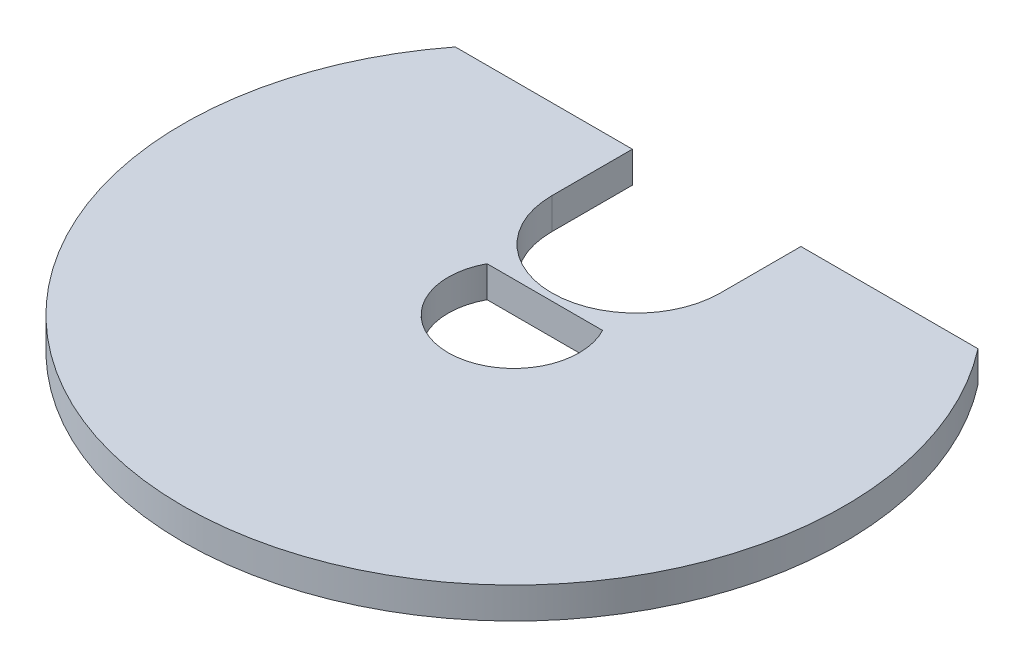
ISO-10303-21;
HEADER;
FILE_DESCRIPTION(('STEP AP214'),'2;1');
FILE_NAME('part.step','',(''),(''),'','','');
FILE_SCHEMA(('AUTOMOTIVE_DESIGN { 1 0 10303 214 1 1 1 1 }'));
ENDSEC;
DATA;
#1=APPLICATION_CONTEXT('core data for automotive mechanical design processes');
#2=APPLICATION_PROTOCOL_DEFINITION('international standard','automotive_design',2000,#1);
#3=PRODUCT_CONTEXT('',#1,'mechanical');
#4=PRODUCT('Part','Part','',(#3));
#5=PRODUCT_RELATED_PRODUCT_CATEGORY('part','',(#4));
#6=PRODUCT_DEFINITION_FORMATION('','',#4);
#7=PRODUCT_DEFINITION_CONTEXT('part definition',#1,'design');
#8=PRODUCT_DEFINITION('design','',#6,#7);
#9=PRODUCT_DEFINITION_SHAPE('','',#8);
#10=(LENGTH_UNIT() NAMED_UNIT(*) SI_UNIT(.MILLI.,.METRE.));
#11=(NAMED_UNIT(*) PLANE_ANGLE_UNIT() SI_UNIT($,.RADIAN.));
#12=(NAMED_UNIT(*) SI_UNIT($,.STERADIAN.) SOLID_ANGLE_UNIT());
#13=UNCERTAINTY_MEASURE_WITH_UNIT(LENGTH_MEASURE(1.E-05),#10,'distance_accuracy_value','');
#14=(GEOMETRIC_REPRESENTATION_CONTEXT(3) GLOBAL_UNCERTAINTY_ASSIGNED_CONTEXT((#13)) GLOBAL_UNIT_ASSIGNED_CONTEXT((#10,
#11,#12)) REPRESENTATION_CONTEXT('',''));
#15=CARTESIAN_POINT('',(0.,0.,0.));
#16=DIRECTION('',(0.,0.,1.));
#17=DIRECTION('',(1.,0.,0.));
#18=AXIS2_PLACEMENT_3D('',#15,#16,#17);
#19=CARTESIAN_POINT('',(-17.145,6.35,-41.275));
#20=DIRECTION('',(-1.,0.,0.));
#21=DIRECTION('',(0.,0.,1.));
#22=AXIS2_PLACEMENT_3D('',#19,#20,#21);
#23=PLANE('',#22);
#24=DIRECTION('',(0.,0.,-1.));
#25=VECTOR('',#24,1.);
#26=CARTESIAN_POINT('',(-17.145,0.,-41.275));
#27=LINE('',#26,#25);
#28=CARTESIAN_POINT('',(-17.145,0.,-24.892));
#29=VERTEX_POINT('',#28);
#30=CARTESIAN_POINT('',(-17.145,0.,-41.275));
#31=VERTEX_POINT('',#30);
#32=EDGE_CURVE('E129',#29,#31,#27,.T.);
#33=ORIENTED_EDGE('',*,*,#32,.T.);
#34=DIRECTION('',(0.,-1.,0.));
#35=VECTOR('',#34,1.);
#36=CARTESIAN_POINT('',(-17.145,6.35,-41.275));
#37=LINE('',#36,#35);
#38=CARTESIAN_POINT('',(-17.145,6.35,-41.275));
#39=VERTEX_POINT('',#38);
#40=EDGE_CURVE('E11',#39,#31,#37,.T.);
#41=ORIENTED_EDGE('',*,*,#40,.F.);
#42=DIRECTION('',(0.,0.,-1.));
#43=VECTOR('',#42,1.);
#44=CARTESIAN_POINT('',(-17.145,6.35,-41.275));
#45=LINE('',#44,#43);
#46=CARTESIAN_POINT('',(-17.145,6.35,-24.892));
#47=VERTEX_POINT('',#46);
#48=EDGE_CURVE('E131',#47,#39,#45,.T.);
#49=ORIENTED_EDGE('',*,*,#48,.F.);
#50=DIRECTION('',(0.,-1.,0.));
#51=VECTOR('',#50,1.);
#52=CARTESIAN_POINT('',(-17.145,6.35,-24.892));
#53=LINE('',#52,#51);
#54=EDGE_CURVE('E151',#47,#29,#53,.T.);
#55=ORIENTED_EDGE('',*,*,#54,.T.);
#56=EDGE_LOOP('',(#33,#41,#49,#55));
#57=FACE_BOUND('',#56,.T.);
#58=ADVANCED_FACE('F42',(#57),#23,.F.);
#59=CARTESIAN_POINT('',(-53.1696386577904,6.35,-41.275));
#60=DIRECTION('',(0.,0.,1.));
#61=DIRECTION('',(1.,0.,0.));
#62=AXIS2_PLACEMENT_3D('',#59,#60,#61);
#63=PLANE('',#62);
#64=DIRECTION('',(-1.,0.,0.));
#65=VECTOR('',#64,1.);
#66=CARTESIAN_POINT('',(-53.1696386577904,0.,-41.275));
#67=LINE('',#66,#65);
#68=CARTESIAN_POINT('',(-53.1696386577904,0.,-41.275));
#69=VERTEX_POINT('',#68);
#70=EDGE_CURVE('E155',#31,#69,#67,.T.);
#71=ORIENTED_EDGE('',*,*,#70,.T.);
#72=DIRECTION('',(0.,-1.,0.));
#73=VECTOR('',#72,1.);
#74=CARTESIAN_POINT('',(-53.1696386577904,6.35,-41.275));
#75=LINE('',#74,#73);
#76=CARTESIAN_POINT('',(-53.1696386577904,6.35,-41.275));
#77=VERTEX_POINT('',#76);
#78=EDGE_CURVE('E50',#77,#69,#75,.T.);
#79=ORIENTED_EDGE('',*,*,#78,.F.);
#80=DIRECTION('',(-1.,0.,0.));
#81=VECTOR('',#80,1.);
#82=CARTESIAN_POINT('',(-53.1696386577904,6.35,-41.275));
#83=LINE('',#82,#81);
#84=EDGE_CURVE('E135',#39,#77,#83,.T.);
#85=ORIENTED_EDGE('',*,*,#84,.F.);
#86=ORIENTED_EDGE('',*,*,#40,.T.);
#87=EDGE_LOOP('',(#71,#79,#85,#86));
#88=FACE_BOUND('',#87,.T.);
#89=ADVANCED_FACE('F210',(#88),#63,.F.);
#90=CARTESIAN_POINT('',(0.,6.35,0.));
#91=DIRECTION('',(0.,-1.,0.));
#92=DIRECTION('',(0.,0.,-1.));
#93=AXIS2_PLACEMENT_3D('',#90,#91,#92);
#94=CYLINDRICAL_SURFACE('',#93,67.31);
#95=CARTESIAN_POINT('',(0.,0.,0.));
#96=DIRECTION('',(0.,1.,0.));
#97=DIRECTION('',(0.,0.,1.));
#98=AXIS2_PLACEMENT_3D('',#95,#96,#97);
#99=CIRCLE('',#98,67.31);
#100=CARTESIAN_POINT('',(53.1696386577904,0.,-41.275));
#101=VERTEX_POINT('',#100);
#102=EDGE_CURVE('E158',#69,#101,#99,.T.);
#103=ORIENTED_EDGE('',*,*,#102,.T.);
#104=DIRECTION('',(0.,-1.,0.));
#105=VECTOR('',#104,1.);
#106=CARTESIAN_POINT('',(53.1696386577904,6.35,-41.275));
#107=LINE('',#106,#105);
#108=CARTESIAN_POINT('',(53.1696386577904,6.35,-41.275));
#109=VERTEX_POINT('',#108);
#110=EDGE_CURVE('E180',#109,#101,#107,.T.);
#111=ORIENTED_EDGE('',*,*,#110,.F.);
#112=CARTESIAN_POINT('',(0.,6.35,0.));
#113=DIRECTION('',(0.,1.,0.));
#114=DIRECTION('',(0.,0.,1.));
#115=AXIS2_PLACEMENT_3D('',#112,#113,#114);
#116=CIRCLE('',#115,67.31);
#117=EDGE_CURVE('E139',#77,#109,#116,.T.);
#118=ORIENTED_EDGE('',*,*,#117,.F.);
#119=ORIENTED_EDGE('',*,*,#78,.T.);
#120=EDGE_LOOP('',(#103,#111,#118,#119));
#121=FACE_BOUND('',#120,.T.);
#122=ADVANCED_FACE('F189',(#121),#94,.T.);
#123=CARTESIAN_POINT('',(17.145,6.35,-41.275));
#124=DIRECTION('',(0.,0.,1.));
#125=DIRECTION('',(1.,0.,0.));
#126=AXIS2_PLACEMENT_3D('',#123,#124,#125);
#127=PLANE('',#126);
#128=DIRECTION('',(-1.,0.,0.));
#129=VECTOR('',#128,1.);
#130=CARTESIAN_POINT('',(17.145,0.,-41.275));
#131=LINE('',#130,#129);
#132=CARTESIAN_POINT('',(17.145,0.,-41.275));
#133=VERTEX_POINT('',#132);
#134=EDGE_CURVE('E161',#101,#133,#131,.T.);
#135=ORIENTED_EDGE('',*,*,#134,.T.);
#136=DIRECTION('',(0.,-1.,0.));
#137=VECTOR('',#136,1.);
#138=CARTESIAN_POINT('',(17.145,6.35,-41.275));
#139=LINE('',#138,#137);
#140=CARTESIAN_POINT('',(17.145,6.35,-41.275));
#141=VERTEX_POINT('',#140);
#142=EDGE_CURVE('E176',#141,#133,#139,.T.);
#143=ORIENTED_EDGE('',*,*,#142,.F.);
#144=DIRECTION('',(-1.,0.,0.));
#145=VECTOR('',#144,1.);
#146=CARTESIAN_POINT('',(17.145,6.35,-41.275));
#147=LINE('',#146,#145);
#148=EDGE_CURVE('E142',#109,#141,#147,.T.);
#149=ORIENTED_EDGE('',*,*,#148,.F.);
#150=ORIENTED_EDGE('',*,*,#110,.T.);
#151=EDGE_LOOP('',(#135,#143,#149,#150));
#152=FACE_BOUND('',#151,.T.);
#153=ADVANCED_FACE('F198',(#152),#127,.F.);
#154=CARTESIAN_POINT('',(17.145,6.35,-24.892));
#155=DIRECTION('',(1.,0.,0.));
#156=DIRECTION('',(0.,0.,-1.));
#157=AXIS2_PLACEMENT_3D('',#154,#155,#156);
#158=PLANE('',#157);
#159=DIRECTION('',(0.,0.,1.));
#160=VECTOR('',#159,1.);
#161=CARTESIAN_POINT('',(17.145,0.,-24.892));
#162=LINE('',#161,#160);
#163=CARTESIAN_POINT('',(17.145,0.,-24.892));
#164=VERTEX_POINT('',#163);
#165=EDGE_CURVE('E164',#133,#164,#162,.T.);
#166=ORIENTED_EDGE('',*,*,#165,.T.);
#167=DIRECTION('',(0.,-1.,0.));
#168=VECTOR('',#167,1.);
#169=CARTESIAN_POINT('',(17.145,6.35,-24.892));
#170=LINE('',#169,#168);
#171=CARTESIAN_POINT('',(17.145,6.35,-24.892));
#172=VERTEX_POINT('',#171);
#173=EDGE_CURVE('E172',#172,#164,#170,.T.);
#174=ORIENTED_EDGE('',*,*,#173,.F.);
#175=DIRECTION('',(0.,0.,1.));
#176=VECTOR('',#175,1.);
#177=CARTESIAN_POINT('',(17.145,6.35,-24.892));
#178=LINE('',#177,#176);
#179=EDGE_CURVE('E145',#141,#172,#178,.T.);
#180=ORIENTED_EDGE('',*,*,#179,.F.);
#181=ORIENTED_EDGE('',*,*,#142,.T.);
#182=EDGE_LOOP('',(#166,#174,#180,#181));
#183=FACE_BOUND('',#182,.T.);
#184=ADVANCED_FACE('F202',(#183),#158,.F.);
#185=CARTESIAN_POINT('',(0.,6.35,-24.892));
#186=DIRECTION('',(0.,-1.,0.));
#187=DIRECTION('',(0.,0.,-1.));
#188=AXIS2_PLACEMENT_3D('',#185,#186,#187);
#189=CYLINDRICAL_SURFACE('',#188,17.145);
#190=CARTESIAN_POINT('',(0.,0.,-24.892));
#191=DIRECTION('',(0.,-1.,0.));
#192=DIRECTION('',(0.,0.,1.));
#193=AXIS2_PLACEMENT_3D('',#190,#191,#192);
#194=CIRCLE('',#193,17.145);
#195=EDGE_CURVE('E136',#164,#29,#194,.T.);
#196=ORIENTED_EDGE('',*,*,#195,.T.);
#197=ORIENTED_EDGE('',*,*,#54,.F.);
#198=CARTESIAN_POINT('',(0.,6.35,-24.892));
#199=DIRECTION('',(0.,-1.,0.));
#200=DIRECTION('',(0.,0.,1.));
#201=AXIS2_PLACEMENT_3D('',#198,#199,#200);
#202=CIRCLE('',#201,17.145);
#203=EDGE_CURVE('E148',#172,#47,#202,.T.);
#204=ORIENTED_EDGE('',*,*,#203,.F.);
#205=ORIENTED_EDGE('',*,*,#173,.T.);
#206=EDGE_LOOP('',(#196,#197,#204,#205));
#207=FACE_BOUND('',#206,.T.);
#208=ADVANCED_FACE('F213',(#207),#189,.F.);
#209=CARTESIAN_POINT('',(0.,6.35,-24.892));
#210=DIRECTION('',(0.,1.,0.));
#211=DIRECTION('',(0.,0.,1.));
#212=AXIS2_PLACEMENT_3D('',#209,#210,#211);
#213=PLANE('',#212);
#214=CARTESIAN_POINT('',(0.,6.35,0.));
#215=DIRECTION('',(0.,1.,0.));
#216=DIRECTION('',(0.,0.,1.));
#217=AXIS2_PLACEMENT_3D('',#214,#215,#216);
#218=CIRCLE('',#217,13.335);
#219=CARTESIAN_POINT('',(-11.7475,6.35,-6.31018769530669));
#220=VERTEX_POINT('',#219);
#221=CARTESIAN_POINT('',(11.7475,6.35,-6.31018769530669));
#222=VERTEX_POINT('',#221);
#223=EDGE_CURVE('E57',#220,#222,#218,.T.);
#224=ORIENTED_EDGE('',*,*,#223,.F.);
#225=DIRECTION('',(-1.,0.,0.));
#226=VECTOR('',#225,1.);
#227=CARTESIAN_POINT('',(-11.7475,6.35,-6.31018769530669));
#228=LINE('',#227,#226);
#229=EDGE_CURVE('E121',#222,#220,#228,.T.);
#230=ORIENTED_EDGE('',*,*,#229,.F.);
#231=EDGE_LOOP('',(#224,#230));
#232=FACE_BOUND('',#231,.T.);
#233=ORIENTED_EDGE('',*,*,#48,.T.);
#234=ORIENTED_EDGE('',*,*,#84,.T.);
#235=ORIENTED_EDGE('',*,*,#117,.T.);
#236=ORIENTED_EDGE('',*,*,#148,.T.);
#237=ORIENTED_EDGE('',*,*,#179,.T.);
#238=ORIENTED_EDGE('',*,*,#203,.T.);
#239=EDGE_LOOP('',(#233,#234,#235,#236,#237,#238));
#240=FACE_BOUND('',#239,.T.);
#241=ADVANCED_FACE('F206',(#232,#240),#213,.T.);
#242=CARTESIAN_POINT('',(0.,0.,-24.892));
#243=DIRECTION('',(0.,1.,0.));
#244=DIRECTION('',(0.,0.,1.));
#245=AXIS2_PLACEMENT_3D('',#242,#243,#244);
#246=PLANE('',#245);
#247=DIRECTION('',(-1.,0.,0.));
#248=VECTOR('',#247,1.);
#249=CARTESIAN_POINT('',(-11.7475,0.,-6.31018769530669));
#250=LINE('',#249,#248);
#251=CARTESIAN_POINT('',(11.7475,0.,-6.31018769530669));
#252=VERTEX_POINT('',#251);
#253=CARTESIAN_POINT('',(-11.7475,0.,-6.31018769530669));
#254=VERTEX_POINT('',#253);
#255=EDGE_CURVE('E111',#252,#254,#250,.T.);
#256=ORIENTED_EDGE('',*,*,#255,.T.);
#257=CARTESIAN_POINT('',(0.,0.,0.));
#258=DIRECTION('',(0.,1.,0.));
#259=DIRECTION('',(0.,0.,1.));
#260=AXIS2_PLACEMENT_3D('',#257,#258,#259);
#261=CIRCLE('',#260,13.335);
#262=EDGE_CURVE('E62',#254,#252,#261,.T.);
#263=ORIENTED_EDGE('',*,*,#262,.T.);
#264=EDGE_LOOP('',(#256,#263));
#265=FACE_BOUND('',#264,.T.);
#266=ORIENTED_EDGE('',*,*,#32,.F.);
#267=ORIENTED_EDGE('',*,*,#195,.F.);
#268=ORIENTED_EDGE('',*,*,#165,.F.);
#269=ORIENTED_EDGE('',*,*,#134,.F.);
#270=ORIENTED_EDGE('',*,*,#102,.F.);
#271=ORIENTED_EDGE('',*,*,#70,.F.);
#272=EDGE_LOOP('',(#266,#267,#268,#269,#270,#271));
#273=FACE_BOUND('',#272,.T.);
#274=ADVANCED_FACE('F118',(#265,#273),#246,.F.);
#275=CARTESIAN_POINT('',(0.,0.,0.));
#276=DIRECTION('',(0.,1.,0.));
#277=DIRECTION('',(0.,0.,1.));
#278=AXIS2_PLACEMENT_3D('',#275,#276,#277);
#279=CYLINDRICAL_SURFACE('',#278,13.335);
#280=ORIENTED_EDGE('',*,*,#223,.T.);
#281=DIRECTION('',(0.,1.,0.));
#282=VECTOR('',#281,1.);
#283=CARTESIAN_POINT('',(11.7475,0.,-6.31018769530669));
#284=LINE('',#283,#282);
#285=EDGE_CURVE('E103',#252,#222,#284,.T.);
#286=ORIENTED_EDGE('',*,*,#285,.F.);
#287=ORIENTED_EDGE('',*,*,#262,.F.);
#288=DIRECTION('',(0.,1.,0.));
#289=VECTOR('',#288,1.);
#290=CARTESIAN_POINT('',(-11.7475,0.,-6.31018769530669));
#291=LINE('',#290,#289);
#292=EDGE_CURVE('E110',#254,#220,#291,.T.);
#293=ORIENTED_EDGE('',*,*,#292,.T.);
#294=EDGE_LOOP('',(#280,#286,#287,#293));
#295=FACE_BOUND('',#294,.T.);
#296=ADVANCED_FACE('F105',(#295),#279,.F.);
#297=CARTESIAN_POINT('',(-11.7475,0.,-6.31018769530669));
#298=DIRECTION('',(0.,0.,-1.));
#299=DIRECTION('',(-1.,0.,0.));
#300=AXIS2_PLACEMENT_3D('',#297,#298,#299);
#301=PLANE('',#300);
#302=ORIENTED_EDGE('',*,*,#229,.T.);
#303=ORIENTED_EDGE('',*,*,#292,.F.);
#304=ORIENTED_EDGE('',*,*,#255,.F.);
#305=ORIENTED_EDGE('',*,*,#285,.T.);
#306=EDGE_LOOP('',(#302,#303,#304,#305));
#307=FACE_BOUND('',#306,.T.);
#308=ADVANCED_FACE('F114',(#307),#301,.F.);
#309=CLOSED_SHELL('',(#58,#89,#122,#153,#184,#208,#241,#274,#296,#308));
#310=MANIFOLD_SOLID_BREP('B2',#309);
#311=ADVANCED_BREP_SHAPE_REPRESENTATION('',(#18,#310),#14);
#312=SHAPE_DEFINITION_REPRESENTATION(#9,#311);
ENDSEC;
END-ISO-10303-21;
